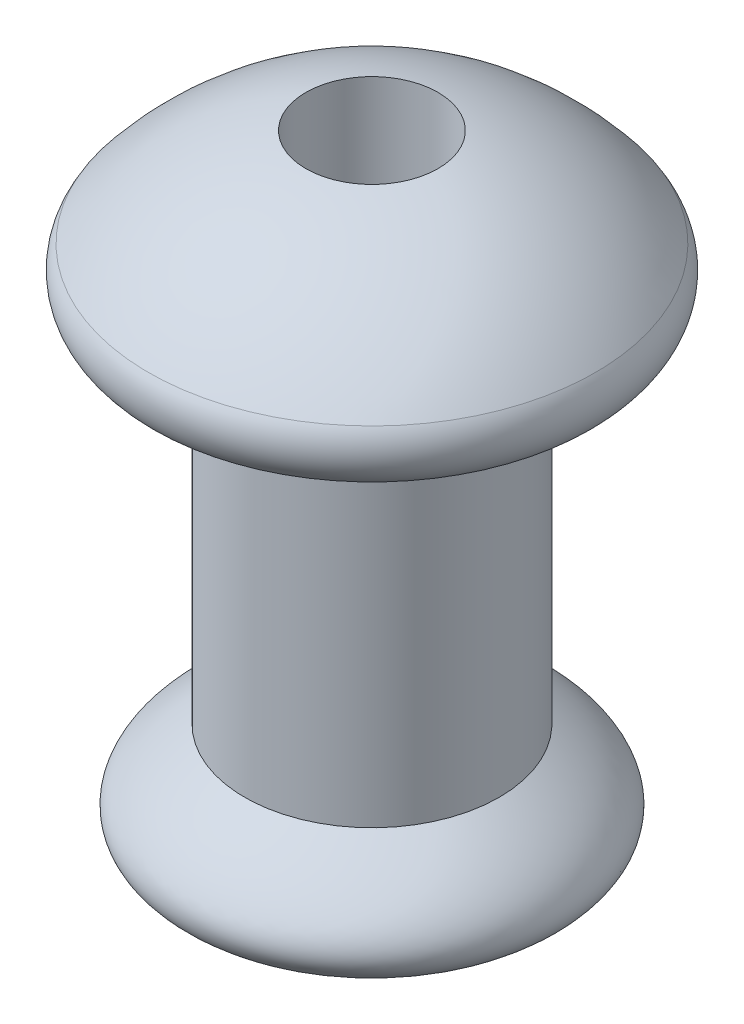
ISO-10303-21;
HEADER;
FILE_DESCRIPTION(('STEP AP214'),'2;1');
FILE_NAME('part.step','',(''),(''),'','','');
FILE_SCHEMA(('AUTOMOTIVE_DESIGN { 1 0 10303 214 1 1 1 1 }'));
ENDSEC;
DATA;
#1=APPLICATION_CONTEXT('core data for automotive mechanical design processes');
#2=APPLICATION_PROTOCOL_DEFINITION('international standard','automotive_design',2000,#1);
#3=PRODUCT_CONTEXT('',#1,'mechanical');
#4=PRODUCT('Part','Part','',(#3));
#5=PRODUCT_RELATED_PRODUCT_CATEGORY('part','',(#4));
#6=PRODUCT_DEFINITION_FORMATION('','',#4);
#7=PRODUCT_DEFINITION_CONTEXT('part definition',#1,'design');
#8=PRODUCT_DEFINITION('design','',#6,#7);
#9=PRODUCT_DEFINITION_SHAPE('','',#8);
#10=(LENGTH_UNIT() NAMED_UNIT(*) SI_UNIT(.MILLI.,.METRE.));
#11=(NAMED_UNIT(*) PLANE_ANGLE_UNIT() SI_UNIT($,.RADIAN.));
#12=(NAMED_UNIT(*) SI_UNIT($,.STERADIAN.) SOLID_ANGLE_UNIT());
#13=UNCERTAINTY_MEASURE_WITH_UNIT(LENGTH_MEASURE(1.E-05),#10,'distance_accuracy_value','');
#14=(GEOMETRIC_REPRESENTATION_CONTEXT(3) GLOBAL_UNCERTAINTY_ASSIGNED_CONTEXT((#13)) GLOBAL_UNIT_ASSIGNED_CONTEXT((#10,
#11,#12)) REPRESENTATION_CONTEXT('',''));
#15=CARTESIAN_POINT('',(0.,0.,0.));
#16=DIRECTION('',(0.,0.,1.));
#17=DIRECTION('',(1.,0.,0.));
#18=AXIS2_PLACEMENT_3D('',#15,#16,#17);
#19=CARTESIAN_POINT('',(-0.0246690593247689,-0.551939079278873,0.));
#20=DIRECTION('',(0.,1.,0.));
#21=DIRECTION('',(-1.,0.,0.));
#22=AXIS2_PLACEMENT_3D('',#19,#20,#21);
#23=DEGENERATE_TOROIDAL_SURFACE('',#22,0.0750108123259118,4.24243475324604,.T.);
#24=CARTESIAN_POINT('',(-0.0246690593247693,3.58842897661131,0.));
#25=DIRECTION('',(0.,-1.,0.));
#26=DIRECTION('',(1.,0.,0.));
#27=AXIS2_PLACEMENT_3D('',#24,#25,#26);
#28=CIRCLE('',#27,1.);
#29=CARTESIAN_POINT('',(0.975330940675231,3.58842897661131,0.));
#30=VERTEX_POINT('',#29);
#31=EDGE_CURVE('E38',#30,#30,#28,.F.);
#32=ORIENTED_EDGE('',*,*,#31,.F.);
#33=EDGE_LOOP('',(#32));
#34=FACE_BOUND('',#33,.T.);
#35=CARTESIAN_POINT('',(-0.0246690593247691,2.10673275662563,0.));
#36=DIRECTION('',(0.,1.,0.));
#37=DIRECTION('',(-1.,0.,0.));
#38=AXIS2_PLACEMENT_3D('',#35,#36,#37);
#39=CIRCLE('',#38,3.38102301806835);
#40=CARTESIAN_POINT('',(-3.40569207739312,2.10673275662563,0.));
#41=VERTEX_POINT('',#40);
#42=EDGE_CURVE('E51',#41,#41,#39,.T.);
#43=ORIENTED_EDGE('',*,*,#42,.T.);
#44=EDGE_LOOP('',(#43));
#45=FACE_BOUND('',#44,.T.);
#46=ADVANCED_FACE('F33',(#34,#45),#23,.T.);
#47=CARTESIAN_POINT('',(1.90146974711775,-4.18789083274121,0.));
#48=CARTESIAN_POINT('',(3.99780339277794,-5.50535285109693,0.));
#49=CARTESIAN_POINT('',(2.40138714966272,-6.00367518527237,0.));
#50=CARTESIAN_POINT('',(0.316595481163095,-6.15804567850246,0.));
#51=B_SPLINE_CURVE_WITH_KNOTS('',3,(#47,#48,#49,#50),.UNSPECIFIED.,.F.,.F.,(4,4),(0.,1.),.UNSPECIFIED.);
#52=CARTESIAN_POINT('',(-0.0246690593247689,-4.14544838699157E-05,0.));
#53=DIRECTION('',(0.,1.,0.));
#54=AXIS1_PLACEMENT('',#52,#53);
#55=SURFACE_OF_REVOLUTION('',#51,#54);
#56=CARTESIAN_POINT('',(-0.0246690593247683,-6.09486532054408,0.));
#57=DIRECTION('',(0.,1.,0.));
#58=DIRECTION('',(-1.,0.,0.));
#59=AXIS2_PLACEMENT_3D('',#56,#57,#58);
#60=CIRCLE('',#59,1.);
#61=CARTESIAN_POINT('',(0.975330940675232,-6.09486532054408,0.));
#62=VERTEX_POINT('',#61);
#63=EDGE_CURVE('E53',#62,#62,#60,.F.);
#64=ORIENTED_EDGE('',*,*,#63,.F.);
#65=EDGE_LOOP('',(#64));
#66=FACE_BOUND('',#65,.T.);
#67=CARTESIAN_POINT('',(-0.0246690593247685,-4.18789083274121,0.));
#68=DIRECTION('',(0.,1.,0.));
#69=DIRECTION('',(-1.,0.,0.));
#70=AXIS2_PLACEMENT_3D('',#67,#68,#69);
#71=CIRCLE('',#70,1.92613880644252);
#72=CARTESIAN_POINT('',(-1.95080786576729,-4.18789083274121,0.));
#73=VERTEX_POINT('',#72);
#74=EDGE_CURVE('E10',#73,#73,#71,.T.);
#75=ORIENTED_EDGE('',*,*,#74,.F.);
#76=EDGE_LOOP('',(#75));
#77=FACE_BOUND('',#76,.T.);
#78=ADVANCED_FACE('F35',(#66,#77),#55,.F.);
#79=CARTESIAN_POINT('',(-0.0246690593247689,-4.14544838699157E-05,0.));
#80=DIRECTION('',(0.,1.,0.));
#81=DIRECTION('',(-1.,0.,0.));
#82=AXIS2_PLACEMENT_3D('',#79,#80,#81);
#83=CYLINDRICAL_SURFACE('',#82,1.92613880644252);
#84=CARTESIAN_POINT('',(-0.0246690593247691,1.31210916725879,0.));
#85=DIRECTION('',(0.,1.,0.));
#86=DIRECTION('',(-1.,0.,0.));
#87=AXIS2_PLACEMENT_3D('',#84,#85,#86);
#88=CIRCLE('',#87,1.92613880644252);
#89=CARTESIAN_POINT('',(-1.95080786576729,1.31210916725879,0.));
#90=VERTEX_POINT('',#89);
#91=EDGE_CURVE('E42',#90,#90,#88,.T.);
#92=ORIENTED_EDGE('',*,*,#91,.F.);
#93=EDGE_LOOP('',(#92));
#94=FACE_BOUND('',#93,.T.);
#95=ORIENTED_EDGE('',*,*,#74,.T.);
#96=EDGE_LOOP('',(#95));
#97=FACE_BOUND('',#96,.T.);
#98=ADVANCED_FACE('F84',(#94,#97),#83,.T.);
#99=CARTESIAN_POINT('',(0.,1.31210916725879,0.));
#100=DIRECTION('',(0.,1.,0.));
#101=DIRECTION('',(-1.,0.,0.));
#102=AXIS2_PLACEMENT_3D('',#99,#100,#101);
#103=PLANE('',#102);
#104=CARTESIAN_POINT('',(-0.0246690593247691,1.31210916725879,0.));
#105=DIRECTION('',(0.,1.,0.));
#106=DIRECTION('',(-1.,0.,0.));
#107=AXIS2_PLACEMENT_3D('',#104,#105,#106);
#108=CIRCLE('',#107,3.29550419741783);
#109=CARTESIAN_POINT('',(-3.3201732567426,1.31210916725879,0.));
#110=VERTEX_POINT('',#109);
#111=EDGE_CURVE('E46',#110,#110,#108,.T.);
#112=ORIENTED_EDGE('',*,*,#111,.F.);
#113=EDGE_LOOP('',(#112));
#114=FACE_BOUND('',#113,.T.);
#115=ORIENTED_EDGE('',*,*,#91,.T.);
#116=EDGE_LOOP('',(#115));
#117=FACE_BOUND('',#116,.T.);
#118=ADVANCED_FACE('F76',(#114,#117),#103,.F.);
#119=CARTESIAN_POINT('',(-0.0246690593247688,1.7609068094732,0.));
#120=DIRECTION('',(0.,1.,0.));
#121=DIRECTION('',(-1.,0.,0.));
#122=AXIS2_PLACEMENT_3D('',#119,#120,#121);
#123=TOROIDAL_SURFACE('',#122,2.8598675230513,0.625458740214205);
#124=ORIENTED_EDGE('',*,*,#111,.T.);
#125=EDGE_LOOP('',(#124));
#126=FACE_BOUND('',#125,.T.);
#127=ORIENTED_EDGE('',*,*,#42,.F.);
#128=EDGE_LOOP('',(#127));
#129=FACE_BOUND('',#128,.T.);
#130=ADVANCED_FACE('F74',(#126,#129),#123,.T.);
#131=CARTESIAN_POINT('',(-0.0246690593247693,3.69049567396717,0.));
#132=DIRECTION('',(0.,-1.,0.));
#133=DIRECTION('',(1.,0.,0.));
#134=AXIS2_PLACEMENT_3D('',#131,#132,#133);
#135=CYLINDRICAL_SURFACE('',#134,1.);
#136=CARTESIAN_POINT('',(0.975330940675232,-6.09486532054408,0.));
#137=CARTESIAN_POINT('',(0.975330940675232,-5.99399767161538,0.));
#138=CARTESIAN_POINT('',(0.975330940675232,-5.89313002268667,0.));
#139=CARTESIAN_POINT('',(0.975330940675232,-5.69139472482927,0.));
#140=CARTESIAN_POINT('',(0.975330940675232,-5.59052707590057,0.));
#141=CARTESIAN_POINT('',(0.975330940675232,-5.38879177804316,0.));
#142=CARTESIAN_POINT('',(0.975330940675232,-5.28792412911446,0.));
#143=CARTESIAN_POINT('',(0.975330940675232,-5.08618883125706,0.));
#144=CARTESIAN_POINT('',(0.975330940675232,-4.98532118232836,0.));
#145=CARTESIAN_POINT('',(0.975330940675232,-4.78358588447095,0.));
#146=CARTESIAN_POINT('',(0.975330940675232,-4.68271823554225,0.));
#147=CARTESIAN_POINT('',(0.975330940675232,-4.48098293768485,0.));
#148=CARTESIAN_POINT('',(0.975330940675232,-4.38011528875614,0.));
#149=CARTESIAN_POINT('',(0.975330940675232,-4.17837999089874,0.));
#150=CARTESIAN_POINT('',(0.975330940675231,-4.07751234197004,0.));
#151=CARTESIAN_POINT('',(0.975330940675231,-3.87577704411264,0.));
#152=CARTESIAN_POINT('',(0.975330940675231,-3.77490939518393,0.));
#153=CARTESIAN_POINT('',(0.975330940675231,-3.57317409732653,0.));
#154=CARTESIAN_POINT('',(0.975330940675231,-3.47230644839783,0.));
#155=CARTESIAN_POINT('',(0.975330940675231,-3.27057115054042,0.));
#156=CARTESIAN_POINT('',(0.975330940675231,-3.16970350161172,0.));
#157=CARTESIAN_POINT('',(0.975330940675231,-2.96796820375432,0.));
#158=CARTESIAN_POINT('',(0.975330940675231,-2.86710055482562,0.));
#159=CARTESIAN_POINT('',(0.975330940675231,-2.66536525696821,0.));
#160=CARTESIAN_POINT('',(0.975330940675231,-2.56449760803951,0.));
#161=CARTESIAN_POINT('',(0.975330940675231,-2.36276231018211,0.));
#162=CARTESIAN_POINT('',(0.975330940675231,-2.2618946612534,0.));
#163=CARTESIAN_POINT('',(0.975330940675231,-2.060159363396,0.));
#164=CARTESIAN_POINT('',(0.975330940675231,-1.9592917144673,0.));
#165=CARTESIAN_POINT('',(0.975330940675231,-1.75755641660989,0.));
#166=CARTESIAN_POINT('',(0.975330940675231,-1.65668876768119,0.));
#167=CARTESIAN_POINT('',(0.975330940675231,-1.45495346982379,0.));
#168=CARTESIAN_POINT('',(0.975330940675231,-1.35408582089509,0.));
#169=CARTESIAN_POINT('',(0.975330940675231,-1.15235052303768,0.));
#170=CARTESIAN_POINT('',(0.975330940675231,-1.05148287410898,0.));
#171=CARTESIAN_POINT('',(0.975330940675231,-0.849747576251576,0.));
#172=CARTESIAN_POINT('',(0.975330940675231,-0.748879927322874,0.));
#173=CARTESIAN_POINT('',(0.975330940675231,-0.54714462946547,0.));
#174=CARTESIAN_POINT('',(0.975330940675231,-0.446276980536769,0.));
#175=CARTESIAN_POINT('',(0.975330940675231,-0.244541682679365,0.));
#176=CARTESIAN_POINT('',(0.975330940675231,-0.143674033750663,0.));
#177=CARTESIAN_POINT('',(0.975330940675231,0.0580612641067405,0.));
#178=CARTESIAN_POINT('',(0.975330940675231,0.158928913035443,0.));
#179=CARTESIAN_POINT('',(0.975330940675231,0.360664210892847,0.));
#180=CARTESIAN_POINT('',(0.975330940675231,0.461531859821549,0.));
#181=CARTESIAN_POINT('',(0.975330940675231,0.663267157678953,0.));
#182=CARTESIAN_POINT('',(0.975330940675231,0.764134806607655,0.));
#183=CARTESIAN_POINT('',(0.975330940675231,0.965870104465058,0.));
#184=CARTESIAN_POINT('',(0.975330940675231,1.06673775339376,0.));
#185=CARTESIAN_POINT('',(0.975330940675231,1.26847305125116,0.));
#186=CARTESIAN_POINT('',(0.975330940675231,1.36934070017987,0.));
#187=CARTESIAN_POINT('',(0.975330940675231,1.57107599803727,0.));
#188=CARTESIAN_POINT('',(0.975330940675231,1.67194364696597,0.));
#189=CARTESIAN_POINT('',(0.975330940675231,1.87367894482338,0.));
#190=CARTESIAN_POINT('',(0.975330940675231,1.97454659375208,0.));
#191=CARTESIAN_POINT('',(0.975330940675231,2.17628189160948,0.));
#192=CARTESIAN_POINT('',(0.975330940675231,2.27714954053818,0.));
#193=CARTESIAN_POINT('',(0.975330940675231,2.47888483839559,0.));
#194=CARTESIAN_POINT('',(0.975330940675231,2.57975248732429,0.));
#195=CARTESIAN_POINT('',(0.975330940675231,2.78148778518169,0.));
#196=CARTESIAN_POINT('',(0.975330940675231,2.88235543411039,0.));
#197=CARTESIAN_POINT('',(0.975330940675231,3.0840907319678,0.));
#198=CARTESIAN_POINT('',(0.975330940675231,3.1849583808965,0.));
#199=CARTESIAN_POINT('',(0.975330940675231,3.38669367875391,0.));
#200=CARTESIAN_POINT('',(0.975330940675231,3.48756132768261,0.));
#201=CARTESIAN_POINT('',(0.975330940675231,3.58842897661131,0.));
#202=B_SPLINE_CURVE_WITH_KNOTS('',3,(#136,#137,#138,#139,#140,#141,#142,#143,#144,#145,#146,
#147,#148,#149,#150,#151,#152,#153,#154,#155,#156,#157,#158,#159,#160,#161,#162,#163,#164,#165,
#166,#167,#168,#169,#170,#171,#172,#173,#174,#175,#176,#177,#178,#179,#180,#181,#182,#183,#184,
#185,#186,#187,#188,#189,#190,#191,#192,#193,#194,#195,#196,#197,#198,#199,#200,#201),
.UNSPECIFIED.,.F.,.F.,(4,2,2,2,2,2,2,2,2,2,2,2,2,2,2,2,2,2,2,2,2,2,2,2,2,2,2,2,2,2,2,2,4),(0.,
0.302602946786105,0.605205893572212,0.907808840358317,1.21041178714442,1.51301473393053,
1.81561768071663,2.11822062750274,2.42082357428885,2.72342652107495,3.02602946786106,
3.32863241464716,3.63123536143327,3.93383830821938,4.23644125500548,4.53904420179159,
4.84164714857769,5.1442500953638,5.4468530421499,5.74945598893601,6.05205893572212,
6.35466188250822,6.65726482929433,6.95986777608043,7.26247072286654,7.56507366965264,
7.86767661643875,8.17027956322486,8.47288251001096,8.77548545679707,9.07808840358317,
9.38069135036928,9.68329429715538),.UNSPECIFIED.);
#203=EDGE_CURVE('BSEAM67',#62,#30,#202,.T.);
#204=ORIENTED_EDGE('',*,*,#63,.T.);
#205=ORIENTED_EDGE('',*,*,#31,.T.);
#206=ORIENTED_EDGE('',*,*,#203,.T.);
#207=ORIENTED_EDGE('',*,*,#203,.F.);
#208=EDGE_LOOP('',(#204,#206,#205,#207));
#209=FACE_BOUND('',#208,.T.);
#210=ADVANCED_FACE('F67',(#209),#135,.F.);
#211=CLOSED_SHELL('',(#46,#78,#98,#118,#130,#210));
#212=MANIFOLD_SOLID_BREP('B2',#211);
#213=ADVANCED_BREP_SHAPE_REPRESENTATION('',(#18,#212),#14);
#214=SHAPE_DEFINITION_REPRESENTATION(#9,#213);
ENDSEC;
END-ISO-10303-21;
